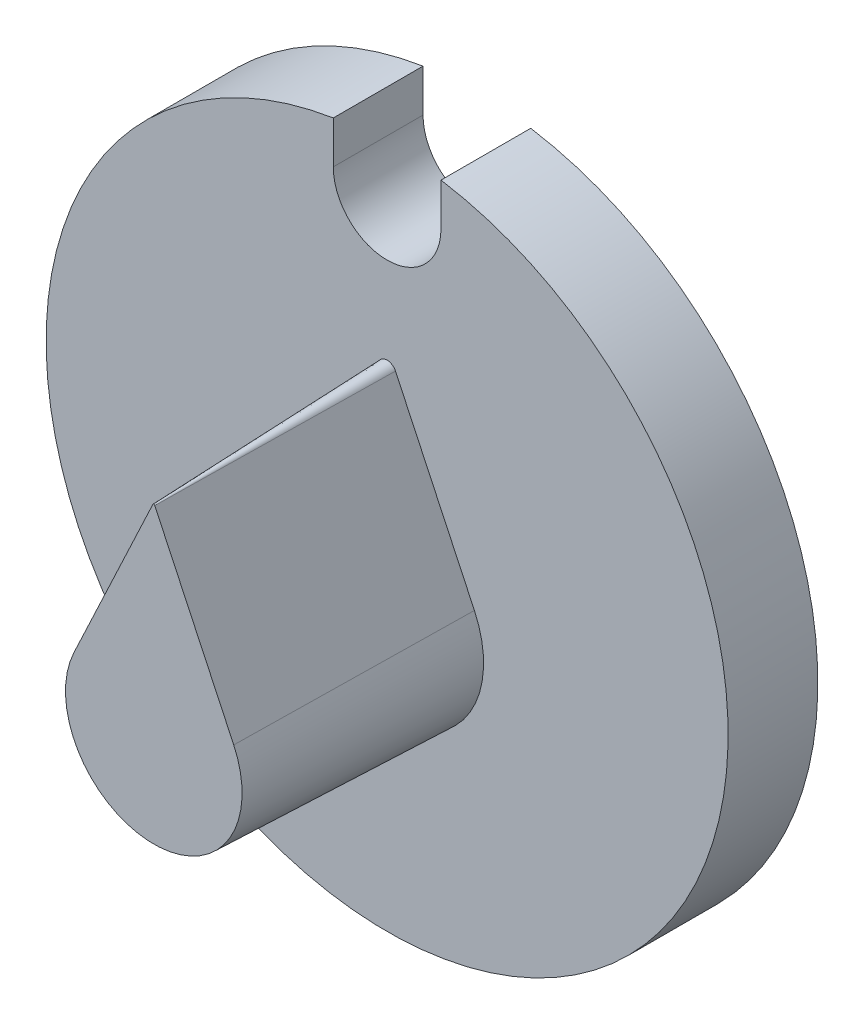
ISO-10303-21;
HEADER;
FILE_DESCRIPTION(('STEP AP214'),'2;1');
FILE_NAME('part.step','',(''),(''),'','','');
FILE_SCHEMA(('AUTOMOTIVE_DESIGN { 1 0 10303 214 1 1 1 1 }'));
ENDSEC;
DATA;
#1=APPLICATION_CONTEXT('core data for automotive mechanical design processes');
#2=APPLICATION_PROTOCOL_DEFINITION('international standard','automotive_design',2000,#1);
#3=PRODUCT_CONTEXT('',#1,'mechanical');
#4=PRODUCT('Part','Part','',(#3));
#5=PRODUCT_RELATED_PRODUCT_CATEGORY('part','',(#4));
#6=PRODUCT_DEFINITION_FORMATION('','',#4);
#7=PRODUCT_DEFINITION_CONTEXT('part definition',#1,'design');
#8=PRODUCT_DEFINITION('design','',#6,#7);
#9=PRODUCT_DEFINITION_SHAPE('','',#8);
#10=(LENGTH_UNIT() NAMED_UNIT(*) SI_UNIT(.MILLI.,.METRE.));
#11=(NAMED_UNIT(*) PLANE_ANGLE_UNIT() SI_UNIT($,.RADIAN.));
#12=(NAMED_UNIT(*) SI_UNIT($,.STERADIAN.) SOLID_ANGLE_UNIT());
#13=UNCERTAINTY_MEASURE_WITH_UNIT(LENGTH_MEASURE(1.E-05),#10,'distance_accuracy_value','');
#14=(GEOMETRIC_REPRESENTATION_CONTEXT(3) GLOBAL_UNCERTAINTY_ASSIGNED_CONTEXT((#13)) GLOBAL_UNIT_ASSIGNED_CONTEXT((#10,
#11,#12)) REPRESENTATION_CONTEXT('',''));
#15=CARTESIAN_POINT('',(0.,0.,0.));
#16=DIRECTION('',(0.,0.,1.));
#17=DIRECTION('',(1.,0.,0.));
#18=AXIS2_PLACEMENT_3D('',#15,#16,#17);
#19=CARTESIAN_POINT('',(0.,4.03,2.50000000005457));
#20=DIRECTION('',(0.,0.,-1.));
#21=DIRECTION('',(-1.,0.,0.));
#22=AXIS2_PLACEMENT_3D('',#19,#20,#21);
#23=CONICAL_SURFACE('',#22,0.256985001694688,0.0349065850400188);
#24=CARTESIAN_POINT('',(0.,4.03,2.49999999999773));
#25=DIRECTION('',(0.,0.,-1.));
#26=DIRECTION('',(-1.,0.,0.));
#27=AXIS2_PLACEMENT_3D('',#24,#25,#26);
#28=CIRCLE('',#27,0.256985001696673);
#29=CARTESIAN_POINT('',(0.232552382696601,4.13936489564313,2.49999999999886));
#30=VERTEX_POINT('',#29);
#31=CARTESIAN_POINT('',(-0.232552382696601,4.13936489564313,2.49999999999886));
#32=VERTEX_POINT('',#31);
#33=EDGE_CURVE('E19',#30,#32,#28,.F.);
#34=ORIENTED_EDGE('',*,*,#33,.T.);
#35=DIRECTION('',(0.0315814582933012,-0.0148521500853025,0.999390827019096));
#36=VECTOR('',#35,1.);
#37=CARTESIAN_POINT('',(-0.0271477768540749,4.04276707530648,9.));
#38=LINE('',#37,#36);
#39=CARTESIAN_POINT('',(-0.0271477768538452,4.04276707530637,9.00000000000728));
#40=VERTEX_POINT('',#39);
#41=EDGE_CURVE('E83',#40,#32,#38,.F.);
#42=ORIENTED_EDGE('',*,*,#41,.F.);
#43=CARTESIAN_POINT('',(0.,4.03,9.00000000001455));
#44=DIRECTION('',(0.,0.,-1.));
#45=DIRECTION('',(-1.,0.,0.));
#46=AXIS2_PLACEMENT_3D('',#43,#44,#45);
#47=CIRCLE('',#46,0.0299999999988647);
#48=CARTESIAN_POINT('',(0.027147776853845,4.04276707530637,9.00000000000728));
#49=VERTEX_POINT('',#48);
#50=EDGE_CURVE('E86',#49,#40,#47,.F.);
#51=ORIENTED_EDGE('',*,*,#50,.F.);
#52=DIRECTION('',(-0.0315814582933012,-0.0148521500853025,0.999390827019096));
#53=VECTOR('',#52,1.);
#54=CARTESIAN_POINT('',(0.0271477768540749,4.04276707530648,9.));
#55=LINE('',#54,#53);
#56=EDGE_CURVE('E84',#30,#49,#55,.T.);
#57=ORIENTED_EDGE('',*,*,#56,.F.);
#58=EDGE_LOOP('',(#34,#42,#51,#57));
#59=FACE_BOUND('',#58,.T.);
#60=ADVANCED_FACE('F16',(#59),#23,.T.);
#61=CARTESIAN_POINT('',(0.,-0.059584240176571,9.));
#62=DIRECTION('',(0.,0.,1.));
#63=DIRECTION('',(1.,0.,0.));
#64=AXIS2_PLACEMENT_3D('',#61,#62,#63);
#65=PLANE('',#64);
#66=CARTESIAN_POINT('',(0.,-1.68,9.00000000001455));
#67=DIRECTION('',(0.,0.,-1.));
#68=DIRECTION('',(-1.,0.,0.));
#69=AXIS2_PLACEMENT_3D('',#66,#67,#68);
#70=CIRCLE('',#69,2.4599999999961);
#71=CARTESIAN_POINT('',(2.22611770203256,-0.633099824869237,9.00000000003934));
#72=VERTEX_POINT('',#71);
#73=CARTESIAN_POINT('',(-2.22611770203178,-0.633099824869705,9.00000000003934));
#74=VERTEX_POINT('',#73);
#75=EDGE_CURVE('E116',#72,#74,#70,.T.);
#76=ORIENTED_EDGE('',*,*,#75,.F.);
#77=DIRECTION('',(-0.425569176882662,0.904925895135847,0.));
#78=VECTOR('',#77,1.);
#79=CARTESIAN_POINT('',(1.57913530723513,0.742636846286204,9.));
#80=LINE('',#79,#78);
#81=EDGE_CURVE('E119',#49,#72,#80,.F.);
#82=ORIENTED_EDGE('',*,*,#81,.F.);
#83=ORIENTED_EDGE('',*,*,#50,.T.);
#84=DIRECTION('',(-0.425569176882662,-0.904925895135847,0.));
#85=VECTOR('',#84,1.);
#86=CARTESIAN_POINT('',(-1.57913530723513,0.742636846286204,9.));
#87=LINE('',#86,#85);
#88=EDGE_CURVE('E94',#74,#40,#87,.F.);
#89=ORIENTED_EDGE('',*,*,#88,.F.);
#90=EDGE_LOOP('',(#76,#82,#83,#89));
#91=FACE_BOUND('',#90,.T.);
#92=ADVANCED_FACE('F137',(#91),#65,.T.);
#93=CARTESIAN_POINT('',(-1.57913530723513,0.742636846286204,9.));
#94=DIRECTION('',(-0.90437463873081,0.425309931638599,0.0348994967025009));
#95=DIRECTION('',(-0.425569176882662,-0.904925895135847,0.));
#96=AXIS2_PLACEMENT_3D('',#93,#94,#95);
#97=PLANE('',#96);
#98=DIRECTION('',(0.425569176882661,0.904925895135847,0.));
#99=VECTOR('',#98,1.);
#100=CARTESIAN_POINT('',(-2.43152230787667,-0.536502004532023,2.5));
#101=LINE('',#100,#99);
#102=CARTESIAN_POINT('',(-2.43152230787441,-0.536502004532983,2.50000000004093));
#103=VERTEX_POINT('',#102);
#104=EDGE_CURVE('E92',#103,#32,#101,.T.);
#105=ORIENTED_EDGE('',*,*,#104,.F.);
#106=DIRECTION('',(0.0315814582933012,-0.0148521500853025,0.999390827019096));
#107=VECTOR('',#106,1.);
#108=CARTESIAN_POINT('',(-15771.2641110644,7415.24101223071,-499000.));
#109=LINE('',#108,#107);
#110=EDGE_CURVE('E114',#74,#103,#109,.F.);
#111=ORIENTED_EDGE('',*,*,#110,.F.);
#112=ORIENTED_EDGE('',*,*,#88,.T.);
#113=ORIENTED_EDGE('',*,*,#41,.T.);
#114=EDGE_LOOP('',(#105,#111,#112,#113));
#115=FACE_BOUND('',#114,.T.);
#116=ADVANCED_FACE('F90',(#115),#97,.T.);
#117=CARTESIAN_POINT('',(1.57913530723513,0.742636846286204,9.));
#118=DIRECTION('',(0.90437463873081,0.425309931638599,0.0348994967025009));
#119=DIRECTION('',(-0.425569176882662,0.904925895135847,0.));
#120=AXIS2_PLACEMENT_3D('',#117,#118,#119);
#121=PLANE('',#120);
#122=DIRECTION('',(-0.0315814582933012,-0.0148521500853025,0.999390827019096));
#123=VECTOR('',#122,1.);
#124=CARTESIAN_POINT('',(15771.2641110644,7415.24101223072,-499000.));
#125=LINE('',#124,#123);
#126=CARTESIAN_POINT('',(2.43152230787536,-0.536502004532892,2.50000000004093));
#127=VERTEX_POINT('',#126);
#128=EDGE_CURVE('E113',#127,#72,#125,.T.);
#129=ORIENTED_EDGE('',*,*,#128,.F.);
#130=DIRECTION('',(0.425569176882662,-0.904925895135847,0.));
#131=VECTOR('',#130,1.);
#132=CARTESIAN_POINT('',(0.232552382696565,4.13936489564311,2.5));
#133=LINE('',#132,#131);
#134=EDGE_CURVE('E101',#30,#127,#133,.T.);
#135=ORIENTED_EDGE('',*,*,#134,.F.);
#136=ORIENTED_EDGE('',*,*,#56,.T.);
#137=ORIENTED_EDGE('',*,*,#81,.T.);
#138=EDGE_LOOP('',(#129,#135,#136,#137));
#139=FACE_BOUND('',#138,.T.);
#140=ADVANCED_FACE('F140',(#139),#121,.T.);
#141=CARTESIAN_POINT('',(0.,-1.68,2.50000000016826));
#142=DIRECTION('',(0.,0.,-1.));
#143=DIRECTION('',(-1.,0.,0.));
#144=AXIS2_PLACEMENT_3D('',#141,#142,#143);
#145=CONICAL_SURFACE('',#144,2.68698500168796,0.0349065850400188);
#146=CARTESIAN_POINT('',(0.,-1.68,2.49999999999773));
#147=DIRECTION('',(0.,0.,-1.));
#148=DIRECTION('',(-1.,0.,0.));
#149=AXIS2_PLACEMENT_3D('',#146,#147,#148);
#150=CIRCLE('',#149,2.68698500169391);
#151=EDGE_CURVE('E100',#127,#103,#150,.T.);
#152=ORIENTED_EDGE('',*,*,#151,.F.);
#153=ORIENTED_EDGE('',*,*,#128,.T.);
#154=ORIENTED_EDGE('',*,*,#75,.T.);
#155=ORIENTED_EDGE('',*,*,#110,.T.);
#156=EDGE_LOOP('',(#152,#153,#154,#155));
#157=FACE_BOUND('',#156,.T.);
#158=ADVANCED_FACE('F142',(#157),#145,.T.);
#159=CARTESIAN_POINT('',(-1.5,8.79041575982343,27.2542654516506));
#160=DIRECTION('',(1.,0.,0.));
#161=DIRECTION('',(0.,1.,0.));
#162=AXIS2_PLACEMENT_3D('',#159,#160,#161);
#163=PLANE('',#162);
#164=DIRECTION('',(0.,0.,-1.));
#165=VECTOR('',#164,1.);
#166=CARTESIAN_POINT('',(-1.5,9.38083151964686,2.5));
#167=LINE('',#166,#165);
#168=CARTESIAN_POINT('',(-1.5,9.38083151964686,2.5));
#169=VERTEX_POINT('',#168);
#170=CARTESIAN_POINT('',(-1.5,9.38083151964686,0.));
#171=VERTEX_POINT('',#170);
#172=EDGE_CURVE('E132',#169,#171,#167,.T.);
#173=ORIENTED_EDGE('',*,*,#172,.F.);
#174=DIRECTION('',(0.,1.,0.));
#175=VECTOR('',#174,1.);
#176=CARTESIAN_POINT('',(-1.5,0.,2.5));
#177=LINE('',#176,#175);
#178=CARTESIAN_POINT('',(-1.5,8.2,2.5));
#179=VERTEX_POINT('',#178);
#180=EDGE_CURVE('E102',#179,#169,#177,.T.);
#181=ORIENTED_EDGE('',*,*,#180,.F.);
#182=DIRECTION('',(0.,0.,-1.));
#183=VECTOR('',#182,1.);
#184=CARTESIAN_POINT('',(-1.5,8.2,27.2542654516506));
#185=LINE('',#184,#183);
#186=CARTESIAN_POINT('',(-1.5,8.2,0.));
#187=VERTEX_POINT('',#186);
#188=EDGE_CURVE('E178',#179,#187,#185,.T.);
#189=ORIENTED_EDGE('',*,*,#188,.T.);
#190=DIRECTION('',(0.,1.,0.));
#191=VECTOR('',#190,1.);
#192=CARTESIAN_POINT('',(-1.5,8.79041575982343,0.));
#193=LINE('',#192,#191);
#194=EDGE_CURVE('E111',#187,#171,#193,.T.);
#195=ORIENTED_EDGE('',*,*,#194,.T.);
#196=EDGE_LOOP('',(#173,#181,#189,#195));
#197=FACE_BOUND('',#196,.T.);
#198=ADVANCED_FACE('F144',(#197),#163,.T.);
#199=CARTESIAN_POINT('',(1.5,8.79041575982343,27.2542654516506));
#200=DIRECTION('',(-1.,0.,0.));
#201=DIRECTION('',(0.,-1.,0.));
#202=AXIS2_PLACEMENT_3D('',#199,#200,#201);
#203=PLANE('',#202);
#204=DIRECTION('',(0.,0.,-1.));
#205=VECTOR('',#204,1.);
#206=CARTESIAN_POINT('',(1.5,8.2,27.2542654516506));
#207=LINE('',#206,#205);
#208=CARTESIAN_POINT('',(1.5,8.2,0.));
#209=VERTEX_POINT('',#208);
#210=CARTESIAN_POINT('',(1.5,8.2,2.5));
#211=VERTEX_POINT('',#210);
#212=EDGE_CURVE('E128',#209,#211,#207,.F.);
#213=ORIENTED_EDGE('',*,*,#212,.T.);
#214=DIRECTION('',(0.,1.,0.));
#215=VECTOR('',#214,1.);
#216=CARTESIAN_POINT('',(1.5,0.,2.5));
#217=LINE('',#216,#215);
#218=CARTESIAN_POINT('',(1.5,9.38083151964686,2.5));
#219=VERTEX_POINT('',#218);
#220=EDGE_CURVE('E105',#219,#211,#217,.F.);
#221=ORIENTED_EDGE('',*,*,#220,.F.);
#222=DIRECTION('',(0.,0.,-1.));
#223=VECTOR('',#222,1.);
#224=CARTESIAN_POINT('',(1.5,9.38083151964686,2.5));
#225=LINE('',#224,#223);
#226=CARTESIAN_POINT('',(1.5,9.38083151964686,0.));
#227=VERTEX_POINT('',#226);
#228=EDGE_CURVE('E181',#227,#219,#225,.F.);
#229=ORIENTED_EDGE('',*,*,#228,.F.);
#230=DIRECTION('',(0.,-1.,0.));
#231=VECTOR('',#230,1.);
#232=CARTESIAN_POINT('',(1.5,8.79041575982343,0.));
#233=LINE('',#232,#231);
#234=EDGE_CURVE('E34',#227,#209,#233,.T.);
#235=ORIENTED_EDGE('',*,*,#234,.T.);
#236=EDGE_LOOP('',(#213,#221,#229,#235));
#237=FACE_BOUND('',#236,.T.);
#238=ADVANCED_FACE('F151',(#237),#203,.T.);
#239=CARTESIAN_POINT('',(0.,0.,2.5));
#240=DIRECTION('',(0.,0.,1.));
#241=DIRECTION('',(1.,0.,0.));
#242=AXIS2_PLACEMENT_3D('',#239,#240,#241);
#243=PLANE('',#242);
#244=ORIENTED_EDGE('',*,*,#134,.T.);
#245=ORIENTED_EDGE('',*,*,#151,.T.);
#246=ORIENTED_EDGE('',*,*,#104,.T.);
#247=ORIENTED_EDGE('',*,*,#33,.F.);
#248=EDGE_LOOP('',(#244,#245,#246,#247));
#249=FACE_BOUND('',#248,.T.);
#250=CARTESIAN_POINT('',(0.,8.2,2.5));
#251=DIRECTION('',(0.,0.,-1.));
#252=DIRECTION('',(-1.,0.,0.));
#253=AXIS2_PLACEMENT_3D('',#250,#251,#252);
#254=CIRCLE('',#253,1.5);
#255=EDGE_CURVE('E125',#211,#179,#254,.T.);
#256=ORIENTED_EDGE('',*,*,#255,.T.);
#257=ORIENTED_EDGE('',*,*,#180,.T.);
#258=CARTESIAN_POINT('',(0.,0.,2.5));
#259=DIRECTION('',(0.,0.,-1.));
#260=DIRECTION('',(-1.,0.,0.));
#261=AXIS2_PLACEMENT_3D('',#258,#259,#260);
#262=CIRCLE('',#261,9.5);
#263=EDGE_CURVE('E129',#219,#169,#262,.T.);
#264=ORIENTED_EDGE('',*,*,#263,.F.);
#265=ORIENTED_EDGE('',*,*,#220,.T.);
#266=EDGE_LOOP('',(#256,#257,#264,#265));
#267=FACE_BOUND('',#266,.T.);
#268=ADVANCED_FACE('F97',(#249,#267),#243,.T.);
#269=CARTESIAN_POINT('',(0.,0.,2.5));
#270=DIRECTION('',(0.,0.,-1.));
#271=DIRECTION('',(-1.,0.,0.));
#272=AXIS2_PLACEMENT_3D('',#269,#270,#271);
#273=CYLINDRICAL_SURFACE('',#272,9.5);
#274=CARTESIAN_POINT('',(0.,0.,0.));
#275=DIRECTION('',(0.,0.,-1.));
#276=DIRECTION('',(-1.,0.,0.));
#277=AXIS2_PLACEMENT_3D('',#274,#275,#276);
#278=CIRCLE('',#277,9.5);
#279=EDGE_CURVE('E25',#171,#227,#278,.F.);
#280=ORIENTED_EDGE('',*,*,#279,.T.);
#281=ORIENTED_EDGE('',*,*,#228,.T.);
#282=ORIENTED_EDGE('',*,*,#263,.T.);
#283=ORIENTED_EDGE('',*,*,#172,.T.);
#284=EDGE_LOOP('',(#280,#281,#282,#283));
#285=FACE_BOUND('',#284,.T.);
#286=ADVANCED_FACE('F163',(#285),#273,.T.);
#287=CARTESIAN_POINT('',(0.,8.2,27.2542654516506));
#288=DIRECTION('',(0.,0.,-1.));
#289=DIRECTION('',(-1.,0.,0.));
#290=AXIS2_PLACEMENT_3D('',#287,#288,#289);
#291=CYLINDRICAL_SURFACE('',#290,1.5);
#292=ORIENTED_EDGE('',*,*,#212,.F.);
#293=CARTESIAN_POINT('',(0.,8.2,0.));
#294=DIRECTION('',(0.,0.,-1.));
#295=DIRECTION('',(-1.,0.,0.));
#296=AXIS2_PLACEMENT_3D('',#293,#294,#295);
#297=CIRCLE('',#296,1.5);
#298=EDGE_CURVE('E10',#209,#187,#297,.T.);
#299=ORIENTED_EDGE('',*,*,#298,.T.);
#300=ORIENTED_EDGE('',*,*,#188,.F.);
#301=ORIENTED_EDGE('',*,*,#255,.F.);
#302=EDGE_LOOP('',(#292,#299,#300,#301));
#303=FACE_BOUND('',#302,.T.);
#304=ADVANCED_FACE('F157',(#303),#291,.F.);
#305=CARTESIAN_POINT('',(0.,0.,0.));
#306=DIRECTION('',(0.,0.,1.));
#307=DIRECTION('',(1.,0.,0.));
#308=AXIS2_PLACEMENT_3D('',#305,#306,#307);
#309=PLANE('',#308);
#310=ORIENTED_EDGE('',*,*,#234,.F.);
#311=ORIENTED_EDGE('',*,*,#279,.F.);
#312=ORIENTED_EDGE('',*,*,#194,.F.);
#313=ORIENTED_EDGE('',*,*,#298,.F.);
#314=EDGE_LOOP('',(#310,#311,#312,#313));
#315=FACE_BOUND('',#314,.T.);
#316=ADVANCED_FACE('F155',(#315),#309,.F.);
#317=CLOSED_SHELL('',(#60,#92,#116,#140,#158,#198,#238,#268,#286,#304,#316));
#318=MANIFOLD_SOLID_BREP('B1',#317);
#319=ADVANCED_BREP_SHAPE_REPRESENTATION('',(#18,#318),#14);
#320=SHAPE_DEFINITION_REPRESENTATION(#9,#319);
ENDSEC;
END-ISO-10303-21;
